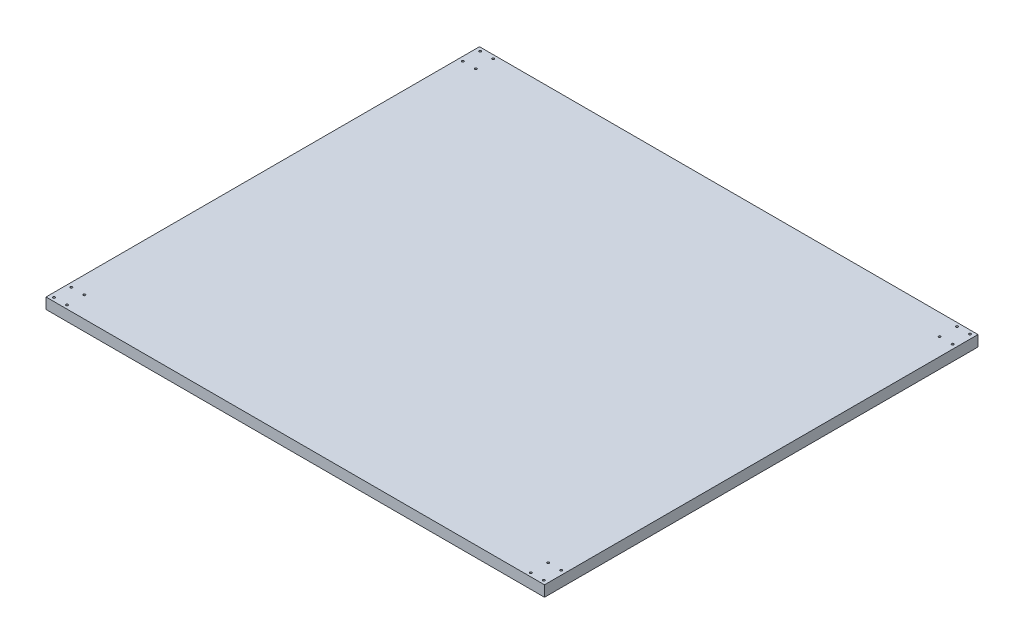
ISO-10303-21;
HEADER;
FILE_DESCRIPTION(('STEP AP214'),'2;1');
FILE_NAME('part.step','',(''),(''),'','','');
FILE_SCHEMA(('AUTOMOTIVE_DESIGN { 1 0 10303 214 1 1 1 1 }'));
ENDSEC;
DATA;
#1=APPLICATION_CONTEXT('core data for automotive mechanical design processes');
#2=APPLICATION_PROTOCOL_DEFINITION('international standard','automotive_design',2000,#1);
#3=PRODUCT_CONTEXT('',#1,'mechanical');
#4=PRODUCT('Part','Part','',(#3));
#5=PRODUCT_RELATED_PRODUCT_CATEGORY('part','',(#4));
#6=PRODUCT_DEFINITION_FORMATION('','',#4);
#7=PRODUCT_DEFINITION_CONTEXT('part definition',#1,'design');
#8=PRODUCT_DEFINITION('design','',#6,#7);
#9=PRODUCT_DEFINITION_SHAPE('','',#8);
#10=(LENGTH_UNIT() NAMED_UNIT(*) SI_UNIT(.MILLI.,.METRE.));
#11=(NAMED_UNIT(*) PLANE_ANGLE_UNIT() SI_UNIT($,.RADIAN.));
#12=(NAMED_UNIT(*) SI_UNIT($,.STERADIAN.) SOLID_ANGLE_UNIT());
#13=UNCERTAINTY_MEASURE_WITH_UNIT(LENGTH_MEASURE(1.E-05),#10,'distance_accuracy_value','');
#14=(GEOMETRIC_REPRESENTATION_CONTEXT(3) GLOBAL_UNCERTAINTY_ASSIGNED_CONTEXT((#13)) GLOBAL_UNIT_ASSIGNED_CONTEXT((#10,
#11,#12)) REPRESENTATION_CONTEXT('',''));
#15=CARTESIAN_POINT('',(0.,0.,0.));
#16=DIRECTION('',(0.,0.,1.));
#17=DIRECTION('',(1.,0.,0.));
#18=AXIS2_PLACEMENT_3D('',#15,#16,#17);
#19=CARTESIAN_POINT('',(345.,15.,300.));
#20=DIRECTION('',(-1.,0.,0.));
#21=DIRECTION('',(0.,0.,1.));
#22=AXIS2_PLACEMENT_3D('',#19,#20,#21);
#23=PLANE('',#22);
#24=DIRECTION('',(0.,0.,-1.));
#25=VECTOR('',#24,1.);
#26=CARTESIAN_POINT('',(345.,0.,300.));
#27=LINE('',#26,#25);
#28=CARTESIAN_POINT('',(345.,0.,300.));
#29=VERTEX_POINT('',#28);
#30=CARTESIAN_POINT('',(345.,0.,-300.));
#31=VERTEX_POINT('',#30);
#32=EDGE_CURVE('E96',#29,#31,#27,.T.);
#33=ORIENTED_EDGE('',*,*,#32,.T.);
#34=DIRECTION('',(0.,-1.,0.));
#35=VECTOR('',#34,1.);
#36=CARTESIAN_POINT('',(345.,15.,-300.));
#37=LINE('',#36,#35);
#38=CARTESIAN_POINT('',(345.,15.,-300.));
#39=VERTEX_POINT('',#38);
#40=EDGE_CURVE('E11',#39,#31,#37,.T.);
#41=ORIENTED_EDGE('',*,*,#40,.F.);
#42=DIRECTION('',(0.,0.,-1.));
#43=VECTOR('',#42,1.);
#44=CARTESIAN_POINT('',(345.,15.,300.));
#45=LINE('',#44,#43);
#46=CARTESIAN_POINT('',(345.,15.,300.));
#47=VERTEX_POINT('',#46);
#48=EDGE_CURVE('E84',#47,#39,#45,.T.);
#49=ORIENTED_EDGE('',*,*,#48,.F.);
#50=DIRECTION('',(0.,-1.,0.));
#51=VECTOR('',#50,1.);
#52=CARTESIAN_POINT('',(345.,15.,300.));
#53=LINE('',#52,#51);
#54=EDGE_CURVE('E92',#47,#29,#53,.T.);
#55=ORIENTED_EDGE('',*,*,#54,.T.);
#56=EDGE_LOOP('',(#33,#41,#49,#55));
#57=FACE_BOUND('',#56,.T.);
#58=ADVANCED_FACE('F33',(#57),#23,.F.);
#59=CARTESIAN_POINT('',(-345.,15.,-300.));
#60=DIRECTION('',(0.,0.,1.));
#61=DIRECTION('',(1.,0.,0.));
#62=AXIS2_PLACEMENT_3D('',#59,#60,#61);
#63=PLANE('',#62);
#64=DIRECTION('',(-1.,0.,0.));
#65=VECTOR('',#64,1.);
#66=CARTESIAN_POINT('',(-345.,0.,-300.));
#67=LINE('',#66,#65);
#68=CARTESIAN_POINT('',(-345.,0.,-300.));
#69=VERTEX_POINT('',#68);
#70=EDGE_CURVE('E88',#31,#69,#67,.T.);
#71=ORIENTED_EDGE('',*,*,#70,.T.);
#72=DIRECTION('',(0.,-1.,0.));
#73=VECTOR('',#72,1.);
#74=CARTESIAN_POINT('',(-345.,15.,-300.));
#75=LINE('',#74,#73);
#76=CARTESIAN_POINT('',(-345.,15.,-300.));
#77=VERTEX_POINT('',#76);
#78=EDGE_CURVE('E41',#77,#69,#75,.T.);
#79=ORIENTED_EDGE('',*,*,#78,.F.);
#80=DIRECTION('',(-1.,0.,0.));
#81=VECTOR('',#80,1.);
#82=CARTESIAN_POINT('',(-345.,15.,-300.));
#83=LINE('',#82,#81);
#84=EDGE_CURVE('E79',#39,#77,#83,.T.);
#85=ORIENTED_EDGE('',*,*,#84,.F.);
#86=ORIENTED_EDGE('',*,*,#40,.T.);
#87=EDGE_LOOP('',(#71,#79,#85,#86));
#88=FACE_BOUND('',#87,.T.);
#89=ADVANCED_FACE('F87',(#88),#63,.F.);
#90=CARTESIAN_POINT('',(-345.,15.,300.));
#91=DIRECTION('',(1.,0.,0.));
#92=DIRECTION('',(0.,0.,-1.));
#93=AXIS2_PLACEMENT_3D('',#90,#91,#92);
#94=PLANE('',#93);
#95=DIRECTION('',(0.,0.,1.));
#96=VECTOR('',#95,1.);
#97=CARTESIAN_POINT('',(-345.,0.,300.));
#98=LINE('',#97,#96);
#99=CARTESIAN_POINT('',(-345.,0.,300.));
#100=VERTEX_POINT('',#99);
#101=EDGE_CURVE('E66',#69,#100,#98,.T.);
#102=ORIENTED_EDGE('',*,*,#101,.T.);
#103=DIRECTION('',(0.,-1.,0.));
#104=VECTOR('',#103,1.);
#105=CARTESIAN_POINT('',(-345.,15.,300.));
#106=LINE('',#105,#104);
#107=CARTESIAN_POINT('',(-345.,15.,300.));
#108=VERTEX_POINT('',#107);
#109=EDGE_CURVE('E89',#108,#100,#106,.T.);
#110=ORIENTED_EDGE('',*,*,#109,.F.);
#111=DIRECTION('',(0.,0.,1.));
#112=VECTOR('',#111,1.);
#113=CARTESIAN_POINT('',(-345.,15.,300.));
#114=LINE('',#113,#112);
#115=EDGE_CURVE('E82',#77,#108,#114,.T.);
#116=ORIENTED_EDGE('',*,*,#115,.F.);
#117=ORIENTED_EDGE('',*,*,#78,.T.);
#118=EDGE_LOOP('',(#102,#110,#116,#117));
#119=FACE_BOUND('',#118,.T.);
#120=ADVANCED_FACE('F90',(#119),#94,.F.);
#121=CARTESIAN_POINT('',(-345.,15.,300.));
#122=DIRECTION('',(0.,0.,-1.));
#123=DIRECTION('',(-1.,0.,0.));
#124=AXIS2_PLACEMENT_3D('',#121,#122,#123);
#125=PLANE('',#124);
#126=DIRECTION('',(1.,0.,0.));
#127=VECTOR('',#126,1.);
#128=CARTESIAN_POINT('',(-345.,0.,300.));
#129=LINE('',#128,#127);
#130=EDGE_CURVE('E72',#100,#29,#129,.T.);
#131=ORIENTED_EDGE('',*,*,#130,.T.);
#132=ORIENTED_EDGE('',*,*,#54,.F.);
#133=DIRECTION('',(1.,0.,0.));
#134=VECTOR('',#133,1.);
#135=CARTESIAN_POINT('',(-345.,15.,300.));
#136=LINE('',#135,#134);
#137=EDGE_CURVE('E49',#108,#47,#136,.T.);
#138=ORIENTED_EDGE('',*,*,#137,.F.);
#139=ORIENTED_EDGE('',*,*,#109,.T.);
#140=EDGE_LOOP('',(#131,#132,#138,#139));
#141=FACE_BOUND('',#140,.T.);
#142=ADVANCED_FACE('F104',(#141),#125,.F.);
#143=CARTESIAN_POINT('',(0.,15.,0.));
#144=DIRECTION('',(0.,-1.,0.));
#145=DIRECTION('',(0.,0.,-1.));
#146=AXIS2_PLACEMENT_3D('',#143,#144,#145);
#147=PLANE('',#146);
#148=CARTESIAN_POINT('',(320.999999999999,15.,-271.));
#149=DIRECTION('',(0.,1.,0.));
#150=DIRECTION('',(0.,0.,-1.));
#151=AXIS2_PLACEMENT_3D('',#148,#149,#150);
#152=CIRCLE('',#151,1.50000000000002);
#153=CARTESIAN_POINT('',(320.999999999999,15.,-272.5));
#154=VERTEX_POINT('',#153);
#155=EDGE_CURVE('E200',#154,#154,#152,.T.);
#156=ORIENTED_EDGE('',*,*,#155,.F.);
#157=EDGE_LOOP('',(#156));
#158=FACE_BOUND('',#157,.T.);
#159=CARTESIAN_POINT('',(339.,15.,-271.));
#160=DIRECTION('',(0.,1.,0.));
#161=DIRECTION('',(0.,0.,-1.));
#162=AXIS2_PLACEMENT_3D('',#159,#160,#161);
#163=CIRCLE('',#162,1.50000000000002);
#164=CARTESIAN_POINT('',(339.,15.,-272.5));
#165=VERTEX_POINT('',#164);
#166=EDGE_CURVE('E194',#165,#165,#163,.T.);
#167=ORIENTED_EDGE('',*,*,#166,.F.);
#168=EDGE_LOOP('',(#167));
#169=FACE_BOUND('',#168,.T.);
#170=CARTESIAN_POINT('',(339.,15.,-295.));
#171=DIRECTION('',(0.,1.,0.));
#172=DIRECTION('',(0.,0.,-1.));
#173=AXIS2_PLACEMENT_3D('',#170,#171,#172);
#174=CIRCLE('',#173,1.50000000000002);
#175=CARTESIAN_POINT('',(339.,15.,-296.5));
#176=VERTEX_POINT('',#175);
#177=EDGE_CURVE('E188',#176,#176,#174,.T.);
#178=ORIENTED_EDGE('',*,*,#177,.F.);
#179=EDGE_LOOP('',(#178));
#180=FACE_BOUND('',#179,.T.);
#181=CARTESIAN_POINT('',(320.999999999999,15.,-295.));
#182=DIRECTION('',(0.,1.,0.));
#183=DIRECTION('',(0.,0.,-1.));
#184=AXIS2_PLACEMENT_3D('',#181,#182,#183);
#185=CIRCLE('',#184,1.50000000000002);
#186=CARTESIAN_POINT('',(320.999999999999,15.,-296.5));
#187=VERTEX_POINT('',#186);
#188=EDGE_CURVE('E182',#187,#187,#185,.T.);
#189=ORIENTED_EDGE('',*,*,#188,.F.);
#190=EDGE_LOOP('',(#189));
#191=FACE_BOUND('',#190,.T.);
#192=CARTESIAN_POINT('',(-321.,15.,-271.));
#193=DIRECTION('',(0.,1.,0.));
#194=DIRECTION('',(0.,0.,1.));
#195=AXIS2_PLACEMENT_3D('',#192,#193,#194);
#196=CIRCLE('',#195,1.49999999999997);
#197=CARTESIAN_POINT('',(-321.,15.,-269.5));
#198=VERTEX_POINT('',#197);
#199=EDGE_CURVE('E176',#198,#198,#196,.T.);
#200=ORIENTED_EDGE('',*,*,#199,.F.);
#201=EDGE_LOOP('',(#200));
#202=FACE_BOUND('',#201,.T.);
#203=CARTESIAN_POINT('',(-339.,15.,-271.));
#204=DIRECTION('',(0.,1.,0.));
#205=DIRECTION('',(0.,0.,1.));
#206=AXIS2_PLACEMENT_3D('',#203,#204,#205);
#207=CIRCLE('',#206,1.50000000000002);
#208=CARTESIAN_POINT('',(-339.,15.,-269.5));
#209=VERTEX_POINT('',#208);
#210=EDGE_CURVE('E170',#209,#209,#207,.T.);
#211=ORIENTED_EDGE('',*,*,#210,.F.);
#212=EDGE_LOOP('',(#211));
#213=FACE_BOUND('',#212,.T.);
#214=CARTESIAN_POINT('',(-339.,15.,-295.));
#215=DIRECTION('',(0.,1.,0.));
#216=DIRECTION('',(0.,0.,1.));
#217=AXIS2_PLACEMENT_3D('',#214,#215,#216);
#218=CIRCLE('',#217,1.50000000000002);
#219=CARTESIAN_POINT('',(-339.,15.,-293.5));
#220=VERTEX_POINT('',#219);
#221=EDGE_CURVE('E164',#220,#220,#218,.T.);
#222=ORIENTED_EDGE('',*,*,#221,.F.);
#223=EDGE_LOOP('',(#222));
#224=FACE_BOUND('',#223,.T.);
#225=CARTESIAN_POINT('',(-321.,15.,-295.));
#226=DIRECTION('',(0.,1.,0.));
#227=DIRECTION('',(0.,0.,1.));
#228=AXIS2_PLACEMENT_3D('',#225,#226,#227);
#229=CIRCLE('',#228,1.49999999999997);
#230=CARTESIAN_POINT('',(-321.,15.,-293.5));
#231=VERTEX_POINT('',#230);
#232=EDGE_CURVE('E158',#231,#231,#229,.T.);
#233=ORIENTED_EDGE('',*,*,#232,.F.);
#234=EDGE_LOOP('',(#233));
#235=FACE_BOUND('',#234,.T.);
#236=CARTESIAN_POINT('',(-321.,15.,271.));
#237=DIRECTION('',(0.,1.,0.));
#238=DIRECTION('',(0.,0.,-1.));
#239=AXIS2_PLACEMENT_3D('',#236,#237,#238);
#240=CIRCLE('',#239,1.50000000000002);
#241=CARTESIAN_POINT('',(-321.,15.,269.5));
#242=VERTEX_POINT('',#241);
#243=EDGE_CURVE('E152',#242,#242,#240,.T.);
#244=ORIENTED_EDGE('',*,*,#243,.F.);
#245=EDGE_LOOP('',(#244));
#246=FACE_BOUND('',#245,.T.);
#247=CARTESIAN_POINT('',(-339.,15.,271.));
#248=DIRECTION('',(0.,1.,0.));
#249=DIRECTION('',(0.,0.,-1.));
#250=AXIS2_PLACEMENT_3D('',#247,#248,#249);
#251=CIRCLE('',#250,1.50000000000002);
#252=CARTESIAN_POINT('',(-339.,15.,269.5));
#253=VERTEX_POINT('',#252);
#254=EDGE_CURVE('E146',#253,#253,#251,.T.);
#255=ORIENTED_EDGE('',*,*,#254,.F.);
#256=EDGE_LOOP('',(#255));
#257=FACE_BOUND('',#256,.T.);
#258=CARTESIAN_POINT('',(-339.,15.,295.));
#259=DIRECTION('',(0.,1.,0.));
#260=DIRECTION('',(0.,0.,-1.));
#261=AXIS2_PLACEMENT_3D('',#258,#259,#260);
#262=CIRCLE('',#261,1.50000000000002);
#263=CARTESIAN_POINT('',(-339.,15.,293.5));
#264=VERTEX_POINT('',#263);
#265=EDGE_CURVE('E140',#264,#264,#262,.T.);
#266=ORIENTED_EDGE('',*,*,#265,.F.);
#267=EDGE_LOOP('',(#266));
#268=FACE_BOUND('',#267,.T.);
#269=CARTESIAN_POINT('',(-321.,15.,295.));
#270=DIRECTION('',(0.,1.,0.));
#271=DIRECTION('',(0.,0.,-1.));
#272=AXIS2_PLACEMENT_3D('',#269,#270,#271);
#273=CIRCLE('',#272,1.50000000000002);
#274=CARTESIAN_POINT('',(-321.,15.,293.5));
#275=VERTEX_POINT('',#274);
#276=EDGE_CURVE('E134',#275,#275,#273,.T.);
#277=ORIENTED_EDGE('',*,*,#276,.F.);
#278=EDGE_LOOP('',(#277));
#279=FACE_BOUND('',#278,.T.);
#280=CARTESIAN_POINT('',(339.,15.,271.));
#281=DIRECTION('',(0.,1.,0.));
#282=DIRECTION('',(0.,0.,1.));
#283=AXIS2_PLACEMENT_3D('',#280,#281,#282);
#284=CIRCLE('',#283,1.50000000000002);
#285=CARTESIAN_POINT('',(339.,15.,272.5));
#286=VERTEX_POINT('',#285);
#287=EDGE_CURVE('E128',#286,#286,#284,.T.);
#288=ORIENTED_EDGE('',*,*,#287,.F.);
#289=EDGE_LOOP('',(#288));
#290=FACE_BOUND('',#289,.T.);
#291=CARTESIAN_POINT('',(321.,15.,271.));
#292=DIRECTION('',(0.,1.,0.));
#293=DIRECTION('',(0.,0.,1.));
#294=AXIS2_PLACEMENT_3D('',#291,#292,#293);
#295=CIRCLE('',#294,1.50000000000002);
#296=CARTESIAN_POINT('',(321.,15.,272.5));
#297=VERTEX_POINT('',#296);
#298=EDGE_CURVE('E122',#297,#297,#295,.T.);
#299=ORIENTED_EDGE('',*,*,#298,.F.);
#300=EDGE_LOOP('',(#299));
#301=FACE_BOUND('',#300,.T.);
#302=CARTESIAN_POINT('',(321.,15.,295.));
#303=DIRECTION('',(0.,1.,0.));
#304=DIRECTION('',(0.,0.,1.));
#305=AXIS2_PLACEMENT_3D('',#302,#303,#304);
#306=CIRCLE('',#305,1.50000000000002);
#307=CARTESIAN_POINT('',(321.,15.,296.5));
#308=VERTEX_POINT('',#307);
#309=EDGE_CURVE('E116',#308,#308,#306,.T.);
#310=ORIENTED_EDGE('',*,*,#309,.F.);
#311=EDGE_LOOP('',(#310));
#312=FACE_BOUND('',#311,.T.);
#313=CARTESIAN_POINT('',(339.,15.,295.));
#314=DIRECTION('',(0.,1.,0.));
#315=DIRECTION('',(0.,0.,1.));
#316=AXIS2_PLACEMENT_3D('',#313,#314,#315);
#317=CIRCLE('',#316,1.50000000000002);
#318=CARTESIAN_POINT('',(339.,15.,296.5));
#319=VERTEX_POINT('',#318);
#320=EDGE_CURVE('E110',#319,#319,#317,.T.);
#321=ORIENTED_EDGE('',*,*,#320,.F.);
#322=EDGE_LOOP('',(#321));
#323=FACE_BOUND('',#322,.T.);
#324=ORIENTED_EDGE('',*,*,#48,.T.);
#325=ORIENTED_EDGE('',*,*,#84,.T.);
#326=ORIENTED_EDGE('',*,*,#115,.T.);
#327=ORIENTED_EDGE('',*,*,#137,.T.);
#328=EDGE_LOOP('',(#324,#325,#326,#327));
#329=FACE_BOUND('',#328,.T.);
#330=ADVANCED_FACE('F80',(#158,#169,#180,#191,#202,#213,#224,#235,#246,#257,#268,#279,#290,#301,
#312,#323,#329),#147,.F.);
#331=CARTESIAN_POINT('',(0.,0.,0.));
#332=DIRECTION('',(0.,-1.,0.));
#333=DIRECTION('',(0.,0.,-1.));
#334=AXIS2_PLACEMENT_3D('',#331,#332,#333);
#335=PLANE('',#334);
#336=CARTESIAN_POINT('',(320.999999999999,0.,-271.));
#337=DIRECTION('',(0.,1.,0.));
#338=DIRECTION('',(0.,0.,-1.));
#339=AXIS2_PLACEMENT_3D('',#336,#337,#338);
#340=CIRCLE('',#339,1.50000000000002);
#341=CARTESIAN_POINT('',(320.999999999999,0.,-272.5));
#342=VERTEX_POINT('',#341);
#343=EDGE_CURVE('E197',#342,#342,#340,.T.);
#344=ORIENTED_EDGE('',*,*,#343,.T.);
#345=EDGE_LOOP('',(#344));
#346=FACE_BOUND('',#345,.T.);
#347=CARTESIAN_POINT('',(339.,0.,-271.));
#348=DIRECTION('',(0.,1.,0.));
#349=DIRECTION('',(0.,0.,-1.));
#350=AXIS2_PLACEMENT_3D('',#347,#348,#349);
#351=CIRCLE('',#350,1.50000000000002);
#352=CARTESIAN_POINT('',(339.,0.,-272.5));
#353=VERTEX_POINT('',#352);
#354=EDGE_CURVE('E191',#353,#353,#351,.T.);
#355=ORIENTED_EDGE('',*,*,#354,.T.);
#356=EDGE_LOOP('',(#355));
#357=FACE_BOUND('',#356,.T.);
#358=CARTESIAN_POINT('',(339.,0.,-295.));
#359=DIRECTION('',(0.,1.,0.));
#360=DIRECTION('',(0.,0.,-1.));
#361=AXIS2_PLACEMENT_3D('',#358,#359,#360);
#362=CIRCLE('',#361,1.50000000000002);
#363=CARTESIAN_POINT('',(339.,0.,-296.5));
#364=VERTEX_POINT('',#363);
#365=EDGE_CURVE('E185',#364,#364,#362,.T.);
#366=ORIENTED_EDGE('',*,*,#365,.T.);
#367=EDGE_LOOP('',(#366));
#368=FACE_BOUND('',#367,.T.);
#369=CARTESIAN_POINT('',(320.999999999999,0.,-295.));
#370=DIRECTION('',(0.,1.,0.));
#371=DIRECTION('',(0.,0.,-1.));
#372=AXIS2_PLACEMENT_3D('',#369,#370,#371);
#373=CIRCLE('',#372,1.50000000000002);
#374=CARTESIAN_POINT('',(320.999999999999,0.,-296.5));
#375=VERTEX_POINT('',#374);
#376=EDGE_CURVE('E179',#375,#375,#373,.T.);
#377=ORIENTED_EDGE('',*,*,#376,.T.);
#378=EDGE_LOOP('',(#377));
#379=FACE_BOUND('',#378,.T.);
#380=CARTESIAN_POINT('',(-321.,0.,-271.));
#381=DIRECTION('',(0.,1.,0.));
#382=DIRECTION('',(0.,0.,1.));
#383=AXIS2_PLACEMENT_3D('',#380,#381,#382);
#384=CIRCLE('',#383,1.49999999999997);
#385=CARTESIAN_POINT('',(-321.,0.,-269.5));
#386=VERTEX_POINT('',#385);
#387=EDGE_CURVE('E173',#386,#386,#384,.T.);
#388=ORIENTED_EDGE('',*,*,#387,.T.);
#389=EDGE_LOOP('',(#388));
#390=FACE_BOUND('',#389,.T.);
#391=CARTESIAN_POINT('',(-339.,0.,-271.));
#392=DIRECTION('',(0.,1.,0.));
#393=DIRECTION('',(0.,0.,1.));
#394=AXIS2_PLACEMENT_3D('',#391,#392,#393);
#395=CIRCLE('',#394,1.50000000000002);
#396=CARTESIAN_POINT('',(-339.,0.,-269.5));
#397=VERTEX_POINT('',#396);
#398=EDGE_CURVE('E167',#397,#397,#395,.T.);
#399=ORIENTED_EDGE('',*,*,#398,.T.);
#400=EDGE_LOOP('',(#399));
#401=FACE_BOUND('',#400,.T.);
#402=CARTESIAN_POINT('',(-339.,0.,-295.));
#403=DIRECTION('',(0.,1.,0.));
#404=DIRECTION('',(0.,0.,1.));
#405=AXIS2_PLACEMENT_3D('',#402,#403,#404);
#406=CIRCLE('',#405,1.50000000000002);
#407=CARTESIAN_POINT('',(-339.,0.,-293.5));
#408=VERTEX_POINT('',#407);
#409=EDGE_CURVE('E161',#408,#408,#406,.T.);
#410=ORIENTED_EDGE('',*,*,#409,.T.);
#411=EDGE_LOOP('',(#410));
#412=FACE_BOUND('',#411,.T.);
#413=CARTESIAN_POINT('',(-321.,0.,-295.));
#414=DIRECTION('',(0.,1.,0.));
#415=DIRECTION('',(0.,0.,1.));
#416=AXIS2_PLACEMENT_3D('',#413,#414,#415);
#417=CIRCLE('',#416,1.49999999999997);
#418=CARTESIAN_POINT('',(-321.,0.,-293.5));
#419=VERTEX_POINT('',#418);
#420=EDGE_CURVE('E155',#419,#419,#417,.T.);
#421=ORIENTED_EDGE('',*,*,#420,.T.);
#422=EDGE_LOOP('',(#421));
#423=FACE_BOUND('',#422,.T.);
#424=CARTESIAN_POINT('',(-321.,0.,271.));
#425=DIRECTION('',(0.,1.,0.));
#426=DIRECTION('',(0.,0.,-1.));
#427=AXIS2_PLACEMENT_3D('',#424,#425,#426);
#428=CIRCLE('',#427,1.50000000000002);
#429=CARTESIAN_POINT('',(-321.,0.,269.5));
#430=VERTEX_POINT('',#429);
#431=EDGE_CURVE('E149',#430,#430,#428,.T.);
#432=ORIENTED_EDGE('',*,*,#431,.T.);
#433=EDGE_LOOP('',(#432));
#434=FACE_BOUND('',#433,.T.);
#435=CARTESIAN_POINT('',(-339.,0.,271.));
#436=DIRECTION('',(0.,1.,0.));
#437=DIRECTION('',(0.,0.,-1.));
#438=AXIS2_PLACEMENT_3D('',#435,#436,#437);
#439=CIRCLE('',#438,1.50000000000002);
#440=CARTESIAN_POINT('',(-339.,0.,269.5));
#441=VERTEX_POINT('',#440);
#442=EDGE_CURVE('E143',#441,#441,#439,.T.);
#443=ORIENTED_EDGE('',*,*,#442,.T.);
#444=EDGE_LOOP('',(#443));
#445=FACE_BOUND('',#444,.T.);
#446=CARTESIAN_POINT('',(-339.,0.,295.));
#447=DIRECTION('',(0.,1.,0.));
#448=DIRECTION('',(0.,0.,-1.));
#449=AXIS2_PLACEMENT_3D('',#446,#447,#448);
#450=CIRCLE('',#449,1.50000000000002);
#451=CARTESIAN_POINT('',(-339.,0.,293.5));
#452=VERTEX_POINT('',#451);
#453=EDGE_CURVE('E137',#452,#452,#450,.T.);
#454=ORIENTED_EDGE('',*,*,#453,.T.);
#455=EDGE_LOOP('',(#454));
#456=FACE_BOUND('',#455,.T.);
#457=CARTESIAN_POINT('',(-321.,0.,295.));
#458=DIRECTION('',(0.,1.,0.));
#459=DIRECTION('',(0.,0.,-1.));
#460=AXIS2_PLACEMENT_3D('',#457,#458,#459);
#461=CIRCLE('',#460,1.50000000000002);
#462=CARTESIAN_POINT('',(-321.,0.,293.5));
#463=VERTEX_POINT('',#462);
#464=EDGE_CURVE('E131',#463,#463,#461,.T.);
#465=ORIENTED_EDGE('',*,*,#464,.T.);
#466=EDGE_LOOP('',(#465));
#467=FACE_BOUND('',#466,.T.);
#468=CARTESIAN_POINT('',(339.,0.,271.));
#469=DIRECTION('',(0.,1.,0.));
#470=DIRECTION('',(0.,0.,1.));
#471=AXIS2_PLACEMENT_3D('',#468,#469,#470);
#472=CIRCLE('',#471,1.50000000000002);
#473=CARTESIAN_POINT('',(339.,0.,272.5));
#474=VERTEX_POINT('',#473);
#475=EDGE_CURVE('E125',#474,#474,#472,.T.);
#476=ORIENTED_EDGE('',*,*,#475,.T.);
#477=EDGE_LOOP('',(#476));
#478=FACE_BOUND('',#477,.T.);
#479=CARTESIAN_POINT('',(321.,0.,271.));
#480=DIRECTION('',(0.,1.,0.));
#481=DIRECTION('',(0.,0.,1.));
#482=AXIS2_PLACEMENT_3D('',#479,#480,#481);
#483=CIRCLE('',#482,1.50000000000002);
#484=CARTESIAN_POINT('',(321.,0.,272.5));
#485=VERTEX_POINT('',#484);
#486=EDGE_CURVE('E119',#485,#485,#483,.T.);
#487=ORIENTED_EDGE('',*,*,#486,.T.);
#488=EDGE_LOOP('',(#487));
#489=FACE_BOUND('',#488,.T.);
#490=CARTESIAN_POINT('',(321.,0.,295.));
#491=DIRECTION('',(0.,1.,0.));
#492=DIRECTION('',(0.,0.,1.));
#493=AXIS2_PLACEMENT_3D('',#490,#491,#492);
#494=CIRCLE('',#493,1.50000000000002);
#495=CARTESIAN_POINT('',(321.,0.,296.5));
#496=VERTEX_POINT('',#495);
#497=EDGE_CURVE('E113',#496,#496,#494,.T.);
#498=ORIENTED_EDGE('',*,*,#497,.T.);
#499=EDGE_LOOP('',(#498));
#500=FACE_BOUND('',#499,.T.);
#501=CARTESIAN_POINT('',(339.,0.,295.));
#502=DIRECTION('',(0.,1.,0.));
#503=DIRECTION('',(0.,0.,1.));
#504=AXIS2_PLACEMENT_3D('',#501,#502,#503);
#505=CIRCLE('',#504,1.50000000000002);
#506=CARTESIAN_POINT('',(339.,0.,296.5));
#507=VERTEX_POINT('',#506);
#508=EDGE_CURVE('E99',#507,#507,#505,.T.);
#509=ORIENTED_EDGE('',*,*,#508,.T.);
#510=EDGE_LOOP('',(#509));
#511=FACE_BOUND('',#510,.T.);
#512=ORIENTED_EDGE('',*,*,#32,.F.);
#513=ORIENTED_EDGE('',*,*,#130,.F.);
#514=ORIENTED_EDGE('',*,*,#101,.F.);
#515=ORIENTED_EDGE('',*,*,#70,.F.);
#516=EDGE_LOOP('',(#512,#513,#514,#515));
#517=FACE_BOUND('',#516,.T.);
#518=ADVANCED_FACE('F107',(#346,#357,#368,#379,#390,#401,#412,#423,#434,#445,#456,#467,#478,
#489,#500,#511,#517),#335,.T.);
#519=CARTESIAN_POINT('',(339.,0.,295.));
#520=DIRECTION('',(0.,1.,0.));
#521=DIRECTION('',(0.,0.,1.));
#522=AXIS2_PLACEMENT_3D('',#519,#520,#521);
#523=CYLINDRICAL_SURFACE('',#522,1.50000000000002);
#524=ORIENTED_EDGE('',*,*,#508,.F.);
#525=EDGE_LOOP('',(#524));
#526=FACE_BOUND('',#525,.T.);
#527=ORIENTED_EDGE('',*,*,#320,.T.);
#528=EDGE_LOOP('',(#527));
#529=FACE_BOUND('',#528,.T.);
#530=ADVANCED_FACE('F248',(#526,#529),#523,.F.);
#531=CARTESIAN_POINT('',(321.,0.,295.));
#532=DIRECTION('',(0.,1.,0.));
#533=DIRECTION('',(0.,0.,1.));
#534=AXIS2_PLACEMENT_3D('',#531,#532,#533);
#535=CYLINDRICAL_SURFACE('',#534,1.50000000000002);
#536=ORIENTED_EDGE('',*,*,#497,.F.);
#537=EDGE_LOOP('',(#536));
#538=FACE_BOUND('',#537,.T.);
#539=ORIENTED_EDGE('',*,*,#309,.T.);
#540=EDGE_LOOP('',(#539));
#541=FACE_BOUND('',#540,.T.);
#542=ADVANCED_FACE('F250',(#538,#541),#535,.F.);
#543=CARTESIAN_POINT('',(321.,0.,271.));
#544=DIRECTION('',(0.,1.,0.));
#545=DIRECTION('',(0.,0.,1.));
#546=AXIS2_PLACEMENT_3D('',#543,#544,#545);
#547=CYLINDRICAL_SURFACE('',#546,1.50000000000002);
#548=ORIENTED_EDGE('',*,*,#486,.F.);
#549=EDGE_LOOP('',(#548));
#550=FACE_BOUND('',#549,.T.);
#551=ORIENTED_EDGE('',*,*,#298,.T.);
#552=EDGE_LOOP('',(#551));
#553=FACE_BOUND('',#552,.T.);
#554=ADVANCED_FACE('F257',(#550,#553),#547,.F.);
#555=CARTESIAN_POINT('',(339.,0.,271.));
#556=DIRECTION('',(0.,1.,0.));
#557=DIRECTION('',(0.,0.,1.));
#558=AXIS2_PLACEMENT_3D('',#555,#556,#557);
#559=CYLINDRICAL_SURFACE('',#558,1.50000000000002);
#560=ORIENTED_EDGE('',*,*,#475,.F.);
#561=EDGE_LOOP('',(#560));
#562=FACE_BOUND('',#561,.T.);
#563=ORIENTED_EDGE('',*,*,#287,.T.);
#564=EDGE_LOOP('',(#563));
#565=FACE_BOUND('',#564,.T.);
#566=ADVANCED_FACE('F305',(#562,#565),#559,.F.);
#567=CARTESIAN_POINT('',(-321.,0.,295.));
#568=DIRECTION('',(0.,1.,0.));
#569=DIRECTION('',(0.,0.,1.));
#570=AXIS2_PLACEMENT_3D('',#567,#568,#569);
#571=CYLINDRICAL_SURFACE('',#570,1.50000000000002);
#572=ORIENTED_EDGE('',*,*,#464,.F.);
#573=EDGE_LOOP('',(#572));
#574=FACE_BOUND('',#573,.T.);
#575=ORIENTED_EDGE('',*,*,#276,.T.);
#576=EDGE_LOOP('',(#575));
#577=FACE_BOUND('',#576,.T.);
#578=ADVANCED_FACE('F315',(#574,#577),#571,.F.);
#579=CARTESIAN_POINT('',(-339.,0.,295.));
#580=DIRECTION('',(0.,1.,0.));
#581=DIRECTION('',(0.,0.,1.));
#582=AXIS2_PLACEMENT_3D('',#579,#580,#581);
#583=CYLINDRICAL_SURFACE('',#582,1.50000000000002);
#584=ORIENTED_EDGE('',*,*,#453,.F.);
#585=EDGE_LOOP('',(#584));
#586=FACE_BOUND('',#585,.T.);
#587=ORIENTED_EDGE('',*,*,#265,.T.);
#588=EDGE_LOOP('',(#587));
#589=FACE_BOUND('',#588,.T.);
#590=ADVANCED_FACE('F325',(#586,#589),#583,.F.);
#591=CARTESIAN_POINT('',(-339.,0.,271.));
#592=DIRECTION('',(0.,1.,0.));
#593=DIRECTION('',(0.,0.,1.));
#594=AXIS2_PLACEMENT_3D('',#591,#592,#593);
#595=CYLINDRICAL_SURFACE('',#594,1.50000000000002);
#596=ORIENTED_EDGE('',*,*,#442,.F.);
#597=EDGE_LOOP('',(#596));
#598=FACE_BOUND('',#597,.T.);
#599=ORIENTED_EDGE('',*,*,#254,.T.);
#600=EDGE_LOOP('',(#599));
#601=FACE_BOUND('',#600,.T.);
#602=ADVANCED_FACE('F335',(#598,#601),#595,.F.);
#603=CARTESIAN_POINT('',(-321.,0.,271.));
#604=DIRECTION('',(0.,1.,0.));
#605=DIRECTION('',(0.,0.,1.));
#606=AXIS2_PLACEMENT_3D('',#603,#604,#605);
#607=CYLINDRICAL_SURFACE('',#606,1.50000000000002);
#608=ORIENTED_EDGE('',*,*,#431,.F.);
#609=EDGE_LOOP('',(#608));
#610=FACE_BOUND('',#609,.T.);
#611=ORIENTED_EDGE('',*,*,#243,.T.);
#612=EDGE_LOOP('',(#611));
#613=FACE_BOUND('',#612,.T.);
#614=ADVANCED_FACE('F345',(#610,#613),#607,.F.);
#615=CARTESIAN_POINT('',(-321.,0.,-295.));
#616=DIRECTION('',(0.,1.,0.));
#617=DIRECTION('',(0.,0.,1.));
#618=AXIS2_PLACEMENT_3D('',#615,#616,#617);
#619=CYLINDRICAL_SURFACE('',#618,1.49999999999997);
#620=ORIENTED_EDGE('',*,*,#420,.F.);
#621=EDGE_LOOP('',(#620));
#622=FACE_BOUND('',#621,.T.);
#623=ORIENTED_EDGE('',*,*,#232,.T.);
#624=EDGE_LOOP('',(#623));
#625=FACE_BOUND('',#624,.T.);
#626=ADVANCED_FACE('F355',(#622,#625),#619,.F.);
#627=CARTESIAN_POINT('',(-339.,0.,-295.));
#628=DIRECTION('',(0.,1.,0.));
#629=DIRECTION('',(0.,0.,1.));
#630=AXIS2_PLACEMENT_3D('',#627,#628,#629);
#631=CYLINDRICAL_SURFACE('',#630,1.50000000000002);
#632=ORIENTED_EDGE('',*,*,#409,.F.);
#633=EDGE_LOOP('',(#632));
#634=FACE_BOUND('',#633,.T.);
#635=ORIENTED_EDGE('',*,*,#221,.T.);
#636=EDGE_LOOP('',(#635));
#637=FACE_BOUND('',#636,.T.);
#638=ADVANCED_FACE('F365',(#634,#637),#631,.F.);
#639=CARTESIAN_POINT('',(-339.,0.,-271.));
#640=DIRECTION('',(0.,1.,0.));
#641=DIRECTION('',(0.,0.,1.));
#642=AXIS2_PLACEMENT_3D('',#639,#640,#641);
#643=CYLINDRICAL_SURFACE('',#642,1.50000000000002);
#644=ORIENTED_EDGE('',*,*,#398,.F.);
#645=EDGE_LOOP('',(#644));
#646=FACE_BOUND('',#645,.T.);
#647=ORIENTED_EDGE('',*,*,#210,.T.);
#648=EDGE_LOOP('',(#647));
#649=FACE_BOUND('',#648,.T.);
#650=ADVANCED_FACE('F375',(#646,#649),#643,.F.);
#651=CARTESIAN_POINT('',(-321.,0.,-271.));
#652=DIRECTION('',(0.,1.,0.));
#653=DIRECTION('',(0.,0.,1.));
#654=AXIS2_PLACEMENT_3D('',#651,#652,#653);
#655=CYLINDRICAL_SURFACE('',#654,1.49999999999997);
#656=ORIENTED_EDGE('',*,*,#387,.F.);
#657=EDGE_LOOP('',(#656));
#658=FACE_BOUND('',#657,.T.);
#659=ORIENTED_EDGE('',*,*,#199,.T.);
#660=EDGE_LOOP('',(#659));
#661=FACE_BOUND('',#660,.T.);
#662=ADVANCED_FACE('F385',(#658,#661),#655,.F.);
#663=CARTESIAN_POINT('',(320.999999999999,0.,-295.));
#664=DIRECTION('',(0.,1.,0.));
#665=DIRECTION('',(0.,0.,1.));
#666=AXIS2_PLACEMENT_3D('',#663,#664,#665);
#667=CYLINDRICAL_SURFACE('',#666,1.50000000000002);
#668=ORIENTED_EDGE('',*,*,#376,.F.);
#669=EDGE_LOOP('',(#668));
#670=FACE_BOUND('',#669,.T.);
#671=ORIENTED_EDGE('',*,*,#188,.T.);
#672=EDGE_LOOP('',(#671));
#673=FACE_BOUND('',#672,.T.);
#674=ADVANCED_FACE('F395',(#670,#673),#667,.F.);
#675=CARTESIAN_POINT('',(339.,0.,-295.));
#676=DIRECTION('',(0.,1.,0.));
#677=DIRECTION('',(0.,0.,1.));
#678=AXIS2_PLACEMENT_3D('',#675,#676,#677);
#679=CYLINDRICAL_SURFACE('',#678,1.50000000000002);
#680=ORIENTED_EDGE('',*,*,#365,.F.);
#681=EDGE_LOOP('',(#680));
#682=FACE_BOUND('',#681,.T.);
#683=ORIENTED_EDGE('',*,*,#177,.T.);
#684=EDGE_LOOP('',(#683));
#685=FACE_BOUND('',#684,.T.);
#686=ADVANCED_FACE('F405',(#682,#685),#679,.F.);
#687=CARTESIAN_POINT('',(339.,0.,-271.));
#688=DIRECTION('',(0.,1.,0.));
#689=DIRECTION('',(0.,0.,1.));
#690=AXIS2_PLACEMENT_3D('',#687,#688,#689);
#691=CYLINDRICAL_SURFACE('',#690,1.50000000000002);
#692=ORIENTED_EDGE('',*,*,#354,.F.);
#693=EDGE_LOOP('',(#692));
#694=FACE_BOUND('',#693,.T.);
#695=ORIENTED_EDGE('',*,*,#166,.T.);
#696=EDGE_LOOP('',(#695));
#697=FACE_BOUND('',#696,.T.);
#698=ADVANCED_FACE('F211',(#694,#697),#691,.F.);
#699=CARTESIAN_POINT('',(320.999999999999,0.,-271.));
#700=DIRECTION('',(0.,1.,0.));
#701=DIRECTION('',(0.,0.,1.));
#702=AXIS2_PLACEMENT_3D('',#699,#700,#701);
#703=CYLINDRICAL_SURFACE('',#702,1.50000000000002);
#704=ORIENTED_EDGE('',*,*,#343,.F.);
#705=EDGE_LOOP('',(#704));
#706=FACE_BOUND('',#705,.T.);
#707=ORIENTED_EDGE('',*,*,#155,.T.);
#708=EDGE_LOOP('',(#707));
#709=FACE_BOUND('',#708,.T.);
#710=ADVANCED_FACE('F208',(#706,#709),#703,.F.);
#711=CLOSED_SHELL('',(#58,#89,#120,#142,#330,#518,#530,#542,#554,#566,#578,#590,#602,#614,#626,
#638,#650,#662,#674,#686,#698,#710));
#712=MANIFOLD_SOLID_BREP('B2',#711);
#713=ADVANCED_BREP_SHAPE_REPRESENTATION('',(#18,#712),#14);
#714=SHAPE_DEFINITION_REPRESENTATION(#9,#713);
ENDSEC;
END-ISO-10303-21;
